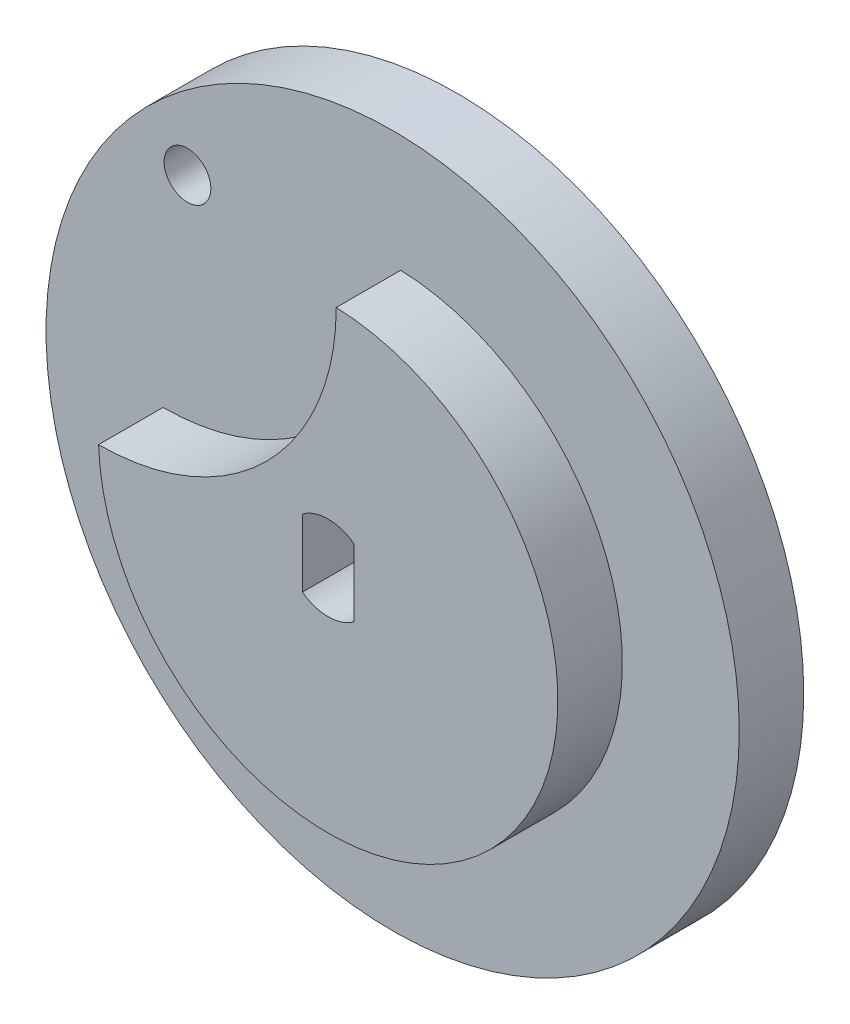
ISO-10303-21;
HEADER;
FILE_DESCRIPTION(('STEP AP214'),'2;1');
FILE_NAME('part.step','',(''),(''),'','','');
FILE_SCHEMA(('AUTOMOTIVE_DESIGN { 1 0 10303 214 1 1 1 1 }'));
ENDSEC;
DATA;
#1=APPLICATION_CONTEXT('core data for automotive mechanical design processes');
#2=APPLICATION_PROTOCOL_DEFINITION('international standard','automotive_design',2000,#1);
#3=PRODUCT_CONTEXT('',#1,'mechanical');
#4=PRODUCT('Part','Part','',(#3));
#5=PRODUCT_RELATED_PRODUCT_CATEGORY('part','',(#4));
#6=PRODUCT_DEFINITION_FORMATION('','',#4);
#7=PRODUCT_DEFINITION_CONTEXT('part definition',#1,'design');
#8=PRODUCT_DEFINITION('design','',#6,#7);
#9=PRODUCT_DEFINITION_SHAPE('','',#8);
#10=(LENGTH_UNIT() NAMED_UNIT(*) SI_UNIT(.MILLI.,.METRE.));
#11=(NAMED_UNIT(*) PLANE_ANGLE_UNIT() SI_UNIT($,.RADIAN.));
#12=(NAMED_UNIT(*) SI_UNIT($,.STERADIAN.) SOLID_ANGLE_UNIT());
#13=UNCERTAINTY_MEASURE_WITH_UNIT(LENGTH_MEASURE(1.E-05),#10,'distance_accuracy_value','');
#14=(GEOMETRIC_REPRESENTATION_CONTEXT(3) GLOBAL_UNCERTAINTY_ASSIGNED_CONTEXT((#13)) GLOBAL_UNIT_ASSIGNED_CONTEXT((#10,
#11,#12)) REPRESENTATION_CONTEXT('',''));
#15=CARTESIAN_POINT('',(0.,0.,0.));
#16=DIRECTION('',(0.,0.,1.));
#17=DIRECTION('',(1.,0.,0.));
#18=AXIS2_PLACEMENT_3D('',#15,#16,#17);
#19=CARTESIAN_POINT('',(0.,0.,4.));
#20=DIRECTION('',(0.,0.,1.));
#21=DIRECTION('',(1.,0.,0.));
#22=AXIS2_PLACEMENT_3D('',#19,#20,#21);
#23=PLANE('',#22);
#24=CARTESIAN_POINT('',(-12.7279220613578,12.7279220613579,4.));
#25=DIRECTION('',(0.,0.,1.));
#26=DIRECTION('',(1.,0.,0.));
#27=AXIS2_PLACEMENT_3D('',#24,#25,#26);
#28=CIRCLE('',#27,1.45);
#29=CARTESIAN_POINT('',(-11.2779220613578,12.7279220613579,4.));
#30=VERTEX_POINT('',#29);
#31=EDGE_CURVE('E183',#30,#30,#28,.T.);
#32=ORIENTED_EDGE('',*,*,#31,.F.);
#33=EDGE_LOOP('',(#32));
#34=FACE_BOUND('',#33,.T.);
#35=CARTESIAN_POINT('',(0.,0.,4.));
#36=DIRECTION('',(0.,0.,1.));
#37=DIRECTION('',(1.,0.,0.));
#38=AXIS2_PLACEMENT_3D('',#35,#36,#37);
#39=CIRCLE('',#38,21.5);
#40=CARTESIAN_POINT('',(21.5,0.,4.));
#41=VERTEX_POINT('',#40);
#42=EDGE_CURVE('E11',#41,#41,#39,.T.);
#43=ORIENTED_EDGE('',*,*,#42,.T.);
#44=EDGE_LOOP('',(#43));
#45=FACE_BOUND('',#44,.T.);
#46=CARTESIAN_POINT('',(0.,0.,4.));
#47=DIRECTION('',(0.,0.,1.));
#48=DIRECTION('',(1.,0.,0.));
#49=AXIS2_PLACEMENT_3D('',#46,#47,#48);
#50=CIRCLE('',#49,14.25);
#51=CARTESIAN_POINT('',(-14.2412280701754,-0.499923047325433,4.));
#52=VERTEX_POINT('',#51);
#53=CARTESIAN_POINT('',(0.499923047325487,14.2412280701754,4.));
#54=VERTEX_POINT('',#53);
#55=EDGE_CURVE('E172',#52,#54,#50,.T.);
#56=ORIENTED_EDGE('',*,*,#55,.F.);
#57=CARTESIAN_POINT('',(-14.25,14.25,4.));
#58=DIRECTION('',(0.,0.,-1.));
#59=DIRECTION('',(1.,0.,0.));
#60=AXIS2_PLACEMENT_3D('',#57,#58,#59);
#61=CIRCLE('',#60,14.7499256557034);
#62=EDGE_CURVE('E167',#54,#52,#61,.T.);
#63=ORIENTED_EDGE('',*,*,#62,.F.);
#64=EDGE_LOOP('',(#56,#63));
#65=FACE_BOUND('',#64,.T.);
#66=ADVANCED_FACE('F49',(#34,#45,#65),#23,.T.);
#67=CARTESIAN_POINT('',(0.,0.,0.));
#68=DIRECTION('',(0.,0.,1.));
#69=DIRECTION('',(1.,0.,0.));
#70=AXIS2_PLACEMENT_3D('',#67,#68,#69);
#71=PLANE('',#70);
#72=CARTESIAN_POINT('',(0.,0.,0.));
#73=DIRECTION('',(0.,0.,1.));
#74=DIRECTION('',(1.,0.,0.));
#75=AXIS2_PLACEMENT_3D('',#72,#73,#74);
#76=CIRCLE('',#75,21.5);
#77=CARTESIAN_POINT('',(21.5,0.,0.));
#78=VERTEX_POINT('',#77);
#79=EDGE_CURVE('E53',#78,#78,#76,.T.);
#80=ORIENTED_EDGE('',*,*,#79,.F.);
#81=EDGE_LOOP('',(#80));
#82=FACE_BOUND('',#81,.T.);
#83=DIRECTION('',(0.,1.,0.));
#84=VECTOR('',#83,1.);
#85=CARTESIAN_POINT('',(1.6,-2.1,0.));
#86=LINE('',#85,#84);
#87=CARTESIAN_POINT('',(1.6,-2.1,0.));
#88=VERTEX_POINT('',#87);
#89=CARTESIAN_POINT('',(1.6,-2.08119661634977,0.));
#90=VERTEX_POINT('',#89);
#91=EDGE_CURVE('E198',#88,#90,#86,.T.);
#92=ORIENTED_EDGE('',*,*,#91,.T.);
#93=CARTESIAN_POINT('',(0.,0.,0.));
#94=DIRECTION('',(0.,0.,-1.));
#95=DIRECTION('',(-1.,0.,0.));
#96=AXIS2_PLACEMENT_3D('',#93,#94,#95);
#97=CIRCLE('',#96,2.62514368290685);
#98=CARTESIAN_POINT('',(1.6,2.08119661634977,0.));
#99=VERTEX_POINT('',#98);
#100=EDGE_CURVE('E129',#99,#90,#97,.T.);
#101=ORIENTED_EDGE('',*,*,#100,.F.);
#102=CARTESIAN_POINT('',(1.6,2.1,0.));
#103=VERTEX_POINT('',#102);
#104=EDGE_CURVE('E140',#99,#103,#86,.T.);
#105=ORIENTED_EDGE('',*,*,#104,.T.);
#106=CARTESIAN_POINT('',(0.,-0.0748563170931541,0.));
#107=DIRECTION('',(0.,0.,1.));
#108=DIRECTION('',(-1.,0.,0.));
#109=AXIS2_PLACEMENT_3D('',#106,#107,#108);
#110=CIRCLE('',#109,2.7);
#111=CARTESIAN_POINT('',(-1.6,2.1,0.));
#112=VERTEX_POINT('',#111);
#113=EDGE_CURVE('E186',#103,#112,#110,.T.);
#114=ORIENTED_EDGE('',*,*,#113,.T.);
#115=DIRECTION('',(0.,-1.,0.));
#116=VECTOR('',#115,1.);
#117=CARTESIAN_POINT('',(-1.6,-2.1,0.));
#118=LINE('',#117,#116);
#119=CARTESIAN_POINT('',(-1.6,2.08119661634977,0.));
#120=VERTEX_POINT('',#119);
#121=EDGE_CURVE('E192',#112,#120,#118,.T.);
#122=ORIENTED_EDGE('',*,*,#121,.T.);
#123=CARTESIAN_POINT('',(0.,0.,0.));
#124=DIRECTION('',(0.,0.,-1.));
#125=DIRECTION('',(-1.,0.,0.));
#126=AXIS2_PLACEMENT_3D('',#123,#124,#125);
#127=CIRCLE('',#126,2.62514368290685);
#128=CARTESIAN_POINT('',(-1.6,-2.08119661634977,0.));
#129=VERTEX_POINT('',#128);
#130=EDGE_CURVE('E148',#129,#120,#127,.T.);
#131=ORIENTED_EDGE('',*,*,#130,.F.);
#132=CARTESIAN_POINT('',(-1.6,-2.1,0.));
#133=VERTEX_POINT('',#132);
#134=EDGE_CURVE('E191',#129,#133,#118,.T.);
#135=ORIENTED_EDGE('',*,*,#134,.T.);
#136=CARTESIAN_POINT('',(0.,0.0748563170931541,0.));
#137=DIRECTION('',(0.,0.,1.));
#138=DIRECTION('',(1.,0.,0.));
#139=AXIS2_PLACEMENT_3D('',#136,#137,#138);
#140=CIRCLE('',#139,2.7);
#141=EDGE_CURVE('E195',#133,#88,#140,.T.);
#142=ORIENTED_EDGE('',*,*,#141,.T.);
#143=EDGE_LOOP('',(#92,#101,#105,#114,#122,#131,#135,#142));
#144=FACE_BOUND('',#143,.T.);
#145=CARTESIAN_POINT('',(-12.7279220613578,12.7279220613579,0.));
#146=DIRECTION('',(0.,0.,1.));
#147=DIRECTION('',(1.,0.,0.));
#148=AXIS2_PLACEMENT_3D('',#145,#146,#147);
#149=CIRCLE('',#148,1.45);
#150=CARTESIAN_POINT('',(-11.2779220613578,12.7279220613579,0.));
#151=VERTEX_POINT('',#150);
#152=EDGE_CURVE('E182',#151,#151,#149,.T.);
#153=ORIENTED_EDGE('',*,*,#152,.T.);
#154=EDGE_LOOP('',(#153));
#155=FACE_BOUND('',#154,.T.);
#156=ADVANCED_FACE('F216',(#82,#144,#155),#71,.F.);
#157=CARTESIAN_POINT('',(0.,0.,4.));
#158=DIRECTION('',(0.,0.,-1.));
#159=DIRECTION('',(-1.,0.,0.));
#160=AXIS2_PLACEMENT_3D('',#157,#158,#159);
#161=CYLINDRICAL_SURFACE('',#160,21.5);
#162=ORIENTED_EDGE('',*,*,#42,.F.);
#163=EDGE_LOOP('',(#162));
#164=FACE_BOUND('',#163,.T.);
#165=ORIENTED_EDGE('',*,*,#79,.T.);
#166=EDGE_LOOP('',(#165));
#167=FACE_BOUND('',#166,.T.);
#168=ADVANCED_FACE('F51',(#164,#167),#161,.T.);
#169=CARTESIAN_POINT('',(0.,-0.0748563170931541,4.));
#170=DIRECTION('',(0.,0.,-1.));
#171=DIRECTION('',(-1.,0.,0.));
#172=AXIS2_PLACEMENT_3D('',#169,#170,#171);
#173=CYLINDRICAL_SURFACE('',#172,2.7);
#174=ORIENTED_EDGE('',*,*,#113,.F.);
#175=DIRECTION('',(0.,0.,-1.));
#176=VECTOR('',#175,1.);
#177=CARTESIAN_POINT('',(1.6,2.1,4.));
#178=LINE('',#177,#176);
#179=CARTESIAN_POINT('',(1.6,2.1,8.));
#180=VERTEX_POINT('',#179);
#181=EDGE_CURVE('E201',#180,#103,#178,.T.);
#182=ORIENTED_EDGE('',*,*,#181,.F.);
#183=CARTESIAN_POINT('',(0.,-0.0748563170931547,8.));
#184=DIRECTION('',(0.,0.,1.));
#185=DIRECTION('',(-1.,0.,0.));
#186=AXIS2_PLACEMENT_3D('',#183,#184,#185);
#187=CIRCLE('',#186,2.7);
#188=CARTESIAN_POINT('',(-1.6,2.1,8.));
#189=VERTEX_POINT('',#188);
#190=EDGE_CURVE('E142',#180,#189,#187,.T.);
#191=ORIENTED_EDGE('',*,*,#190,.T.);
#192=DIRECTION('',(0.,0.,-1.));
#193=VECTOR('',#192,1.);
#194=CARTESIAN_POINT('',(-1.6,2.1,4.));
#195=LINE('',#194,#193);
#196=EDGE_CURVE('E208',#189,#112,#195,.T.);
#197=ORIENTED_EDGE('',*,*,#196,.T.);
#198=EDGE_LOOP('',(#174,#182,#191,#197));
#199=FACE_BOUND('',#198,.T.);
#200=ADVANCED_FACE('F248',(#199),#173,.F.);
#201=CARTESIAN_POINT('',(-1.6,-2.1,4.));
#202=DIRECTION('',(1.,0.,0.));
#203=DIRECTION('',(0.,0.,-1.));
#204=AXIS2_PLACEMENT_3D('',#201,#202,#203);
#205=PLANE('',#204);
#206=DIRECTION('',(0.,0.,-1.));
#207=VECTOR('',#206,1.);
#208=CARTESIAN_POINT('',(-1.6,-2.08119661634977,1.5));
#209=LINE('',#208,#207);
#210=CARTESIAN_POINT('',(-1.6,-2.08119661634977,1.5));
#211=VERTEX_POINT('',#210);
#212=EDGE_CURVE('E150',#211,#129,#209,.T.);
#213=ORIENTED_EDGE('',*,*,#212,.F.);
#214=DIRECTION('',(0.,-1.,0.));
#215=VECTOR('',#214,1.);
#216=CARTESIAN_POINT('',(-1.6,0.,1.5));
#217=LINE('',#216,#215);
#218=CARTESIAN_POINT('',(-1.6,2.08119661634977,1.5));
#219=VERTEX_POINT('',#218);
#220=EDGE_CURVE('E146',#219,#211,#217,.T.);
#221=ORIENTED_EDGE('',*,*,#220,.F.);
#222=DIRECTION('',(0.,0.,-1.));
#223=VECTOR('',#222,1.);
#224=CARTESIAN_POINT('',(-1.6,2.08119661634977,1.5));
#225=LINE('',#224,#223);
#226=EDGE_CURVE('E152',#219,#120,#225,.T.);
#227=ORIENTED_EDGE('',*,*,#226,.T.);
#228=ORIENTED_EDGE('',*,*,#121,.F.);
#229=ORIENTED_EDGE('',*,*,#196,.F.);
#230=DIRECTION('',(0.,-1.,0.));
#231=VECTOR('',#230,1.);
#232=CARTESIAN_POINT('',(-1.6,-2.1,8.));
#233=LINE('',#232,#231);
#234=CARTESIAN_POINT('',(-1.6,-2.1,8.));
#235=VERTEX_POINT('',#234);
#236=EDGE_CURVE('E158',#189,#235,#233,.T.);
#237=ORIENTED_EDGE('',*,*,#236,.T.);
#238=DIRECTION('',(0.,0.,-1.));
#239=VECTOR('',#238,1.);
#240=CARTESIAN_POINT('',(-1.6,-2.1,4.));
#241=LINE('',#240,#239);
#242=EDGE_CURVE('E205',#235,#133,#241,.T.);
#243=ORIENTED_EDGE('',*,*,#242,.T.);
#244=ORIENTED_EDGE('',*,*,#134,.F.);
#245=EDGE_LOOP('',(#213,#221,#227,#228,#229,#237,#243,#244));
#246=FACE_BOUND('',#245,.T.);
#247=ADVANCED_FACE('F250',(#246),#205,.T.);
#248=CARTESIAN_POINT('',(0.,0.0748563170931541,4.));
#249=DIRECTION('',(0.,0.,-1.));
#250=DIRECTION('',(-1.,0.,0.));
#251=AXIS2_PLACEMENT_3D('',#248,#249,#250);
#252=CYLINDRICAL_SURFACE('',#251,2.7);
#253=ORIENTED_EDGE('',*,*,#141,.F.);
#254=ORIENTED_EDGE('',*,*,#242,.F.);
#255=CARTESIAN_POINT('',(0.,0.0748563170931547,8.));
#256=DIRECTION('',(0.,0.,1.));
#257=DIRECTION('',(1.,0.,0.));
#258=AXIS2_PLACEMENT_3D('',#255,#256,#257);
#259=CIRCLE('',#258,2.7);
#260=CARTESIAN_POINT('',(1.6,-2.1,8.));
#261=VERTEX_POINT('',#260);
#262=EDGE_CURVE('E161',#235,#261,#259,.T.);
#263=ORIENTED_EDGE('',*,*,#262,.T.);
#264=DIRECTION('',(0.,0.,-1.));
#265=VECTOR('',#264,1.);
#266=CARTESIAN_POINT('',(1.6,-2.1,4.));
#267=LINE('',#266,#265);
#268=EDGE_CURVE('E203',#261,#88,#267,.T.);
#269=ORIENTED_EDGE('',*,*,#268,.T.);
#270=EDGE_LOOP('',(#253,#254,#263,#269));
#271=FACE_BOUND('',#270,.T.);
#272=ADVANCED_FACE('F237',(#271),#252,.F.);
#273=CARTESIAN_POINT('',(1.6,-2.1,4.));
#274=DIRECTION('',(-1.,0.,0.));
#275=DIRECTION('',(0.,0.,1.));
#276=AXIS2_PLACEMENT_3D('',#273,#274,#275);
#277=PLANE('',#276);
#278=DIRECTION('',(0.,0.,-1.));
#279=VECTOR('',#278,1.);
#280=CARTESIAN_POINT('',(1.6,2.08119661634977,1.5));
#281=LINE('',#280,#279);
#282=CARTESIAN_POINT('',(1.6,2.08119661634977,1.5));
#283=VERTEX_POINT('',#282);
#284=EDGE_CURVE('E133',#283,#99,#281,.T.);
#285=ORIENTED_EDGE('',*,*,#284,.F.);
#286=DIRECTION('',(0.,1.,0.));
#287=VECTOR('',#286,1.);
#288=CARTESIAN_POINT('',(1.6,0.,1.5));
#289=LINE('',#288,#287);
#290=CARTESIAN_POINT('',(1.6,-2.08119661634977,1.5));
#291=VERTEX_POINT('',#290);
#292=EDGE_CURVE('E124',#291,#283,#289,.T.);
#293=ORIENTED_EDGE('',*,*,#292,.F.);
#294=DIRECTION('',(0.,0.,-1.));
#295=VECTOR('',#294,1.);
#296=CARTESIAN_POINT('',(1.6,-2.08119661634977,1.5));
#297=LINE('',#296,#295);
#298=EDGE_CURVE('E135',#291,#90,#297,.T.);
#299=ORIENTED_EDGE('',*,*,#298,.T.);
#300=ORIENTED_EDGE('',*,*,#91,.F.);
#301=ORIENTED_EDGE('',*,*,#268,.F.);
#302=DIRECTION('',(0.,1.,0.));
#303=VECTOR('',#302,1.);
#304=CARTESIAN_POINT('',(1.6,-2.1,8.));
#305=LINE('',#304,#303);
#306=EDGE_CURVE('E164',#261,#180,#305,.T.);
#307=ORIENTED_EDGE('',*,*,#306,.T.);
#308=ORIENTED_EDGE('',*,*,#181,.T.);
#309=ORIENTED_EDGE('',*,*,#104,.F.);
#310=EDGE_LOOP('',(#285,#293,#299,#300,#301,#307,#308,#309));
#311=FACE_BOUND('',#310,.T.);
#312=ADVANCED_FACE('F138',(#311),#277,.T.);
#313=CARTESIAN_POINT('',(-12.7279220613578,12.7279220613579,4.));
#314=DIRECTION('',(0.,0.,-1.));
#315=DIRECTION('',(-1.,0.,0.));
#316=AXIS2_PLACEMENT_3D('',#313,#314,#315);
#317=CYLINDRICAL_SURFACE('',#316,1.45);
#318=ORIENTED_EDGE('',*,*,#31,.T.);
#319=EDGE_LOOP('',(#318));
#320=FACE_BOUND('',#319,.T.);
#321=ORIENTED_EDGE('',*,*,#152,.F.);
#322=EDGE_LOOP('',(#321));
#323=FACE_BOUND('',#322,.T.);
#324=ADVANCED_FACE('F223',(#320,#323),#317,.F.);
#325=CARTESIAN_POINT('',(-7.125,7.12500000000002,8.));
#326=DIRECTION('',(0.,0.,1.));
#327=DIRECTION('',(1.,0.,0.));
#328=AXIS2_PLACEMENT_3D('',#325,#326,#327);
#329=PLANE('',#328);
#330=CARTESIAN_POINT('',(-14.25,14.25,8.));
#331=DIRECTION('',(0.,0.,-1.));
#332=DIRECTION('',(1.,0.,0.));
#333=AXIS2_PLACEMENT_3D('',#330,#331,#332);
#334=CIRCLE('',#333,14.7499256557034);
#335=CARTESIAN_POINT('',(0.499923047325487,14.2412280701754,8.));
#336=VERTEX_POINT('',#335);
#337=CARTESIAN_POINT('',(-14.2412280701754,-0.499923047325433,8.));
#338=VERTEX_POINT('',#337);
#339=EDGE_CURVE('E168',#336,#338,#334,.T.);
#340=ORIENTED_EDGE('',*,*,#339,.T.);
#341=CARTESIAN_POINT('',(0.,0.,8.));
#342=DIRECTION('',(0.,0.,1.));
#343=DIRECTION('',(1.,0.,0.));
#344=AXIS2_PLACEMENT_3D('',#341,#342,#343);
#345=CIRCLE('',#344,14.25);
#346=EDGE_CURVE('E171',#338,#336,#345,.T.);
#347=ORIENTED_EDGE('',*,*,#346,.T.);
#348=EDGE_LOOP('',(#340,#347));
#349=FACE_BOUND('',#348,.T.);
#350=ORIENTED_EDGE('',*,*,#236,.F.);
#351=ORIENTED_EDGE('',*,*,#190,.F.);
#352=ORIENTED_EDGE('',*,*,#306,.F.);
#353=ORIENTED_EDGE('',*,*,#262,.F.);
#354=EDGE_LOOP('',(#350,#351,#352,#353));
#355=FACE_BOUND('',#354,.T.);
#356=ADVANCED_FACE('F225',(#349,#355),#329,.T.);
#357=CARTESIAN_POINT('',(-14.25,14.25,8.));
#358=DIRECTION('',(0.,0.,-1.));
#359=DIRECTION('',(-1.,0.,0.));
#360=AXIS2_PLACEMENT_3D('',#357,#358,#359);
#361=CYLINDRICAL_SURFACE('',#360,14.7499256557034);
#362=ORIENTED_EDGE('',*,*,#62,.T.);
#363=DIRECTION('',(0.,0.,-1.));
#364=VECTOR('',#363,1.);
#365=CARTESIAN_POINT('',(-14.2412280701754,-0.499923047325433,8.));
#366=LINE('',#365,#364);
#367=EDGE_CURVE('E179',#338,#52,#366,.T.);
#368=ORIENTED_EDGE('',*,*,#367,.F.);
#369=ORIENTED_EDGE('',*,*,#339,.F.);
#370=DIRECTION('',(0.,0.,-1.));
#371=VECTOR('',#370,1.);
#372=CARTESIAN_POINT('',(0.499923047325487,14.2412280701754,8.));
#373=LINE('',#372,#371);
#374=EDGE_CURVE('E174',#336,#54,#373,.T.);
#375=ORIENTED_EDGE('',*,*,#374,.T.);
#376=EDGE_LOOP('',(#362,#368,#369,#375));
#377=FACE_BOUND('',#376,.T.);
#378=ADVANCED_FACE('F233',(#377),#361,.F.);
#379=CARTESIAN_POINT('',(0.,0.,8.));
#380=DIRECTION('',(0.,0.,-1.));
#381=DIRECTION('',(-1.,0.,0.));
#382=AXIS2_PLACEMENT_3D('',#379,#380,#381);
#383=CYLINDRICAL_SURFACE('',#382,14.25);
#384=ORIENTED_EDGE('',*,*,#55,.T.);
#385=ORIENTED_EDGE('',*,*,#374,.F.);
#386=ORIENTED_EDGE('',*,*,#346,.F.);
#387=ORIENTED_EDGE('',*,*,#367,.T.);
#388=EDGE_LOOP('',(#384,#385,#386,#387));
#389=FACE_BOUND('',#388,.T.);
#390=ADVANCED_FACE('F281',(#389),#383,.T.);
#391=CARTESIAN_POINT('',(0.,0.,1.5));
#392=DIRECTION('',(0.,0.,-1.));
#393=DIRECTION('',(-1.,0.,0.));
#394=AXIS2_PLACEMENT_3D('',#391,#392,#393);
#395=CYLINDRICAL_SURFACE('',#394,2.62514368290685);
#396=ORIENTED_EDGE('',*,*,#100,.T.);
#397=ORIENTED_EDGE('',*,*,#298,.F.);
#398=CARTESIAN_POINT('',(0.,0.,1.5));
#399=DIRECTION('',(0.,0.,-1.));
#400=DIRECTION('',(-1.,0.,0.));
#401=AXIS2_PLACEMENT_3D('',#398,#399,#400);
#402=CIRCLE('',#401,2.62514368290685);
#403=EDGE_CURVE('E70',#283,#291,#402,.T.);
#404=ORIENTED_EDGE('',*,*,#403,.F.);
#405=ORIENTED_EDGE('',*,*,#284,.T.);
#406=EDGE_LOOP('',(#396,#397,#404,#405));
#407=FACE_BOUND('',#406,.T.);
#408=ADVANCED_FACE('F132',(#407),#395,.F.);
#409=CARTESIAN_POINT('',(0.,0.,1.5));
#410=DIRECTION('',(0.,0.,-1.));
#411=DIRECTION('',(-1.,0.,0.));
#412=AXIS2_PLACEMENT_3D('',#409,#410,#411);
#413=PLANE('',#412);
#414=ORIENTED_EDGE('',*,*,#292,.T.);
#415=ORIENTED_EDGE('',*,*,#403,.T.);
#416=EDGE_LOOP('',(#414,#415));
#417=FACE_BOUND('',#416,.T.);
#418=ADVANCED_FACE('F125',(#417),#413,.T.);
#419=CARTESIAN_POINT('',(0.,0.,1.5));
#420=DIRECTION('',(0.,0.,-1.));
#421=DIRECTION('',(-1.,0.,0.));
#422=AXIS2_PLACEMENT_3D('',#419,#420,#421);
#423=CYLINDRICAL_SURFACE('',#422,2.62514368290685);
#424=ORIENTED_EDGE('',*,*,#130,.T.);
#425=ORIENTED_EDGE('',*,*,#226,.F.);
#426=CARTESIAN_POINT('',(0.,0.,1.5));
#427=DIRECTION('',(0.,0.,-1.));
#428=DIRECTION('',(-1.,0.,0.));
#429=AXIS2_PLACEMENT_3D('',#426,#427,#428);
#430=CIRCLE('',#429,2.62514368290685);
#431=EDGE_CURVE('E63',#211,#219,#430,.T.);
#432=ORIENTED_EDGE('',*,*,#431,.F.);
#433=ORIENTED_EDGE('',*,*,#212,.T.);
#434=EDGE_LOOP('',(#424,#425,#432,#433));
#435=FACE_BOUND('',#434,.T.);
#436=ADVANCED_FACE('F269',(#435),#423,.F.);
#437=CARTESIAN_POINT('',(0.,0.,1.5));
#438=DIRECTION('',(0.,0.,-1.));
#439=DIRECTION('',(-1.,0.,0.));
#440=AXIS2_PLACEMENT_3D('',#437,#438,#439);
#441=PLANE('',#440);
#442=ORIENTED_EDGE('',*,*,#220,.T.);
#443=ORIENTED_EDGE('',*,*,#431,.T.);
#444=EDGE_LOOP('',(#442,#443));
#445=FACE_BOUND('',#444,.T.);
#446=ADVANCED_FACE('F271',(#445),#441,.T.);
#447=CLOSED_SHELL('',(#66,#156,#168,#200,#247,#272,#312,#324,#356,#378,#390,#408,#418,#436,#446));
#448=MANIFOLD_SOLID_BREP('B2',#447);
#449=ADVANCED_BREP_SHAPE_REPRESENTATION('',(#18,#448),#14);
#450=SHAPE_DEFINITION_REPRESENTATION(#9,#449);
ENDSEC;
END-ISO-10303-21;
